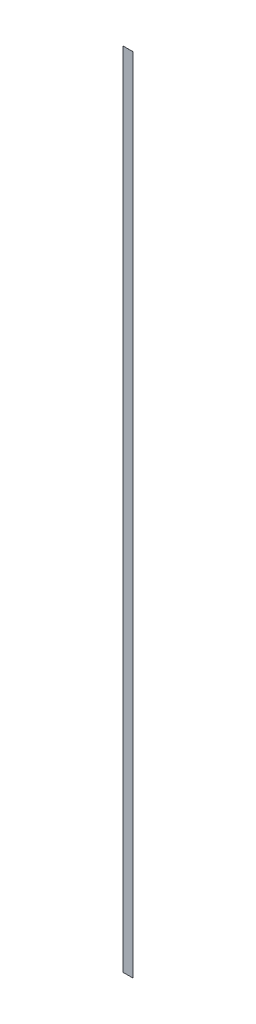
ISO-10303-21;
HEADER;
FILE_DESCRIPTION(('STEP AP214'),'2;1');
FILE_NAME('part.step','',(''),(''),'','','');
FILE_SCHEMA(('AUTOMOTIVE_DESIGN { 1 0 10303 214 1 1 1 1 }'));
ENDSEC;
DATA;
#1=APPLICATION_CONTEXT('core data for automotive mechanical design processes');
#2=APPLICATION_PROTOCOL_DEFINITION('international standard','automotive_design',2000,#1);
#3=PRODUCT_CONTEXT('',#1,'mechanical');
#4=PRODUCT('Part','Part','',(#3));
#5=PRODUCT_RELATED_PRODUCT_CATEGORY('part','',(#4));
#6=PRODUCT_DEFINITION_FORMATION('','',#4);
#7=PRODUCT_DEFINITION_CONTEXT('part definition',#1,'design');
#8=PRODUCT_DEFINITION('design','',#6,#7);
#9=PRODUCT_DEFINITION_SHAPE('','',#8);
#10=(LENGTH_UNIT() NAMED_UNIT(*) SI_UNIT(.MILLI.,.METRE.));
#11=(NAMED_UNIT(*) PLANE_ANGLE_UNIT() SI_UNIT($,.RADIAN.));
#12=(NAMED_UNIT(*) SI_UNIT($,.STERADIAN.) SOLID_ANGLE_UNIT());
#13=UNCERTAINTY_MEASURE_WITH_UNIT(LENGTH_MEASURE(1.E-05),#10,'distance_accuracy_value','');
#14=(GEOMETRIC_REPRESENTATION_CONTEXT(3) GLOBAL_UNCERTAINTY_ASSIGNED_CONTEXT((#13)) GLOBAL_UNIT_ASSIGNED_CONTEXT((#10,
#11,#12)) REPRESENTATION_CONTEXT('',''));
#15=CARTESIAN_POINT('',(0.,0.,0.));
#16=DIRECTION('',(0.,0.,1.));
#17=DIRECTION('',(1.,0.,0.));
#18=AXIS2_PLACEMENT_3D('',#15,#16,#17);
#19=CARTESIAN_POINT('',(0.,0.,15.));
#20=DIRECTION('',(-1.,0.,0.));
#21=DIRECTION('',(0.,0.,1.));
#22=AXIS2_PLACEMENT_3D('',#19,#20,#21);
#23=PLANE('',#22);
#24=DIRECTION('',(0.,1.,0.));
#25=VECTOR('',#24,1.);
#26=CARTESIAN_POINT('',(0.,0.,0.));
#27=LINE('',#26,#25);
#28=CARTESIAN_POINT('',(0.,0.,0.));
#29=VERTEX_POINT('',#28);
#30=CARTESIAN_POINT('',(0.,250000.,0.));
#31=VERTEX_POINT('',#30);
#32=EDGE_CURVE('E96',#29,#31,#27,.T.);
#33=ORIENTED_EDGE('',*,*,#32,.T.);
#34=DIRECTION('',(0.,0.,-1.));
#35=VECTOR('',#34,1.);
#36=CARTESIAN_POINT('',(0.,250000.,15.));
#37=LINE('',#36,#35);
#38=CARTESIAN_POINT('',(0.,250000.,15.));
#39=VERTEX_POINT('',#38);
#40=EDGE_CURVE('E11',#39,#31,#37,.T.);
#41=ORIENTED_EDGE('',*,*,#40,.F.);
#42=DIRECTION('',(0.,1.,0.));
#43=VECTOR('',#42,1.);
#44=CARTESIAN_POINT('',(0.,0.,15.));
#45=LINE('',#44,#43);
#46=CARTESIAN_POINT('',(0.,0.,15.));
#47=VERTEX_POINT('',#46);
#48=EDGE_CURVE('E84',#47,#39,#45,.T.);
#49=ORIENTED_EDGE('',*,*,#48,.F.);
#50=DIRECTION('',(0.,0.,-1.));
#51=VECTOR('',#50,1.);
#52=CARTESIAN_POINT('',(0.,0.,15.));
#53=LINE('',#52,#51);
#54=EDGE_CURVE('E92',#47,#29,#53,.T.);
#55=ORIENTED_EDGE('',*,*,#54,.T.);
#56=EDGE_LOOP('',(#33,#41,#49,#55));
#57=FACE_BOUND('',#56,.T.);
#58=ADVANCED_FACE('F33',(#57),#23,.F.);
#59=CARTESIAN_POINT('',(0.,250000.,15.));
#60=DIRECTION('',(0.,-1.,0.));
#61=DIRECTION('',(0.,0.,-1.));
#62=AXIS2_PLACEMENT_3D('',#59,#60,#61);
#63=PLANE('',#62);
#64=DIRECTION('',(-1.,0.,0.));
#65=VECTOR('',#64,1.);
#66=CARTESIAN_POINT('',(0.,250000.,0.));
#67=LINE('',#66,#65);
#68=CARTESIAN_POINT('',(-3000.,250000.,0.));
#69=VERTEX_POINT('',#68);
#70=EDGE_CURVE('E88',#31,#69,#67,.T.);
#71=ORIENTED_EDGE('',*,*,#70,.T.);
#72=DIRECTION('',(0.,0.,-1.));
#73=VECTOR('',#72,1.);
#74=CARTESIAN_POINT('',(-3000.,250000.,15.));
#75=LINE('',#74,#73);
#76=CARTESIAN_POINT('',(-3000.,250000.,15.));
#77=VERTEX_POINT('',#76);
#78=EDGE_CURVE('E41',#77,#69,#75,.T.);
#79=ORIENTED_EDGE('',*,*,#78,.F.);
#80=DIRECTION('',(-1.,0.,0.));
#81=VECTOR('',#80,1.);
#82=CARTESIAN_POINT('',(0.,250000.,15.));
#83=LINE('',#82,#81);
#84=EDGE_CURVE('E79',#39,#77,#83,.T.);
#85=ORIENTED_EDGE('',*,*,#84,.F.);
#86=ORIENTED_EDGE('',*,*,#40,.T.);
#87=EDGE_LOOP('',(#71,#79,#85,#86));
#88=FACE_BOUND('',#87,.T.);
#89=ADVANCED_FACE('F87',(#88),#63,.F.);
#90=CARTESIAN_POINT('',(-3000.,-3.67394039744206E-13,15.));
#91=DIRECTION('',(1.,0.,0.));
#92=DIRECTION('',(0.,0.,-1.));
#93=AXIS2_PLACEMENT_3D('',#90,#91,#92);
#94=PLANE('',#93);
#95=DIRECTION('',(0.,-1.,0.));
#96=VECTOR('',#95,1.);
#97=CARTESIAN_POINT('',(-3000.,-3.67394039744206E-13,0.));
#98=LINE('',#97,#96);
#99=CARTESIAN_POINT('',(-3000.,-3.67394039744206E-13,0.));
#100=VERTEX_POINT('',#99);
#101=EDGE_CURVE('E66',#69,#100,#98,.T.);
#102=ORIENTED_EDGE('',*,*,#101,.T.);
#103=DIRECTION('',(0.,0.,-1.));
#104=VECTOR('',#103,1.);
#105=CARTESIAN_POINT('',(-3000.,-3.67394039744206E-13,15.));
#106=LINE('',#105,#104);
#107=CARTESIAN_POINT('',(-3000.,-3.67394039744206E-13,15.));
#108=VERTEX_POINT('',#107);
#109=EDGE_CURVE('E89',#108,#100,#106,.T.);
#110=ORIENTED_EDGE('',*,*,#109,.F.);
#111=DIRECTION('',(0.,-1.,0.));
#112=VECTOR('',#111,1.);
#113=CARTESIAN_POINT('',(-3000.,-3.67394039744206E-13,15.));
#114=LINE('',#113,#112);
#115=EDGE_CURVE('E82',#77,#108,#114,.T.);
#116=ORIENTED_EDGE('',*,*,#115,.F.);
#117=ORIENTED_EDGE('',*,*,#78,.T.);
#118=EDGE_LOOP('',(#102,#110,#116,#117));
#119=FACE_BOUND('',#118,.T.);
#120=ADVANCED_FACE('F90',(#119),#94,.F.);
#121=CARTESIAN_POINT('',(0.,0.,15.));
#122=DIRECTION('',(0.,1.,0.));
#123=DIRECTION('',(-1.,0.,0.));
#124=AXIS2_PLACEMENT_3D('',#121,#122,#123);
#125=PLANE('',#124);
#126=DIRECTION('',(1.,0.,0.));
#127=VECTOR('',#126,1.);
#128=CARTESIAN_POINT('',(0.,0.,0.));
#129=LINE('',#128,#127);
#130=EDGE_CURVE('E72',#100,#29,#129,.T.);
#131=ORIENTED_EDGE('',*,*,#130,.T.);
#132=ORIENTED_EDGE('',*,*,#54,.F.);
#133=DIRECTION('',(1.,0.,0.));
#134=VECTOR('',#133,1.);
#135=CARTESIAN_POINT('',(0.,0.,15.));
#136=LINE('',#135,#134);
#137=EDGE_CURVE('E49',#108,#47,#136,.T.);
#138=ORIENTED_EDGE('',*,*,#137,.F.);
#139=ORIENTED_EDGE('',*,*,#109,.T.);
#140=EDGE_LOOP('',(#131,#132,#138,#139));
#141=FACE_BOUND('',#140,.T.);
#142=ADVANCED_FACE('F103',(#141),#125,.F.);
#143=CARTESIAN_POINT('',(0.,0.,15.));
#144=DIRECTION('',(0.,0.,1.));
#145=DIRECTION('',(1.,0.,0.));
#146=AXIS2_PLACEMENT_3D('',#143,#144,#145);
#147=PLANE('',#146);
#148=ORIENTED_EDGE('',*,*,#48,.T.);
#149=ORIENTED_EDGE('',*,*,#84,.T.);
#150=ORIENTED_EDGE('',*,*,#115,.T.);
#151=ORIENTED_EDGE('',*,*,#137,.T.);
#152=EDGE_LOOP('',(#148,#149,#150,#151));
#153=FACE_BOUND('',#152,.T.);
#154=ADVANCED_FACE('F80',(#153),#147,.T.);
#155=CARTESIAN_POINT('',(0.,0.,0.));
#156=DIRECTION('',(0.,0.,1.));
#157=DIRECTION('',(1.,0.,0.));
#158=AXIS2_PLACEMENT_3D('',#155,#156,#157);
#159=PLANE('',#158);
#160=ORIENTED_EDGE('',*,*,#32,.F.);
#161=ORIENTED_EDGE('',*,*,#130,.F.);
#162=ORIENTED_EDGE('',*,*,#101,.F.);
#163=ORIENTED_EDGE('',*,*,#70,.F.);
#164=EDGE_LOOP('',(#160,#161,#162,#163));
#165=FACE_BOUND('',#164,.T.);
#166=ADVANCED_FACE('F106',(#165),#159,.F.);
#167=CLOSED_SHELL('',(#58,#89,#120,#142,#154,#166));
#168=MANIFOLD_SOLID_BREP('B2',#167);
#169=ADVANCED_BREP_SHAPE_REPRESENTATION('',(#18,#168),#14);
#170=SHAPE_DEFINITION_REPRESENTATION(#9,#169);
ENDSEC;
END-ISO-10303-21;
